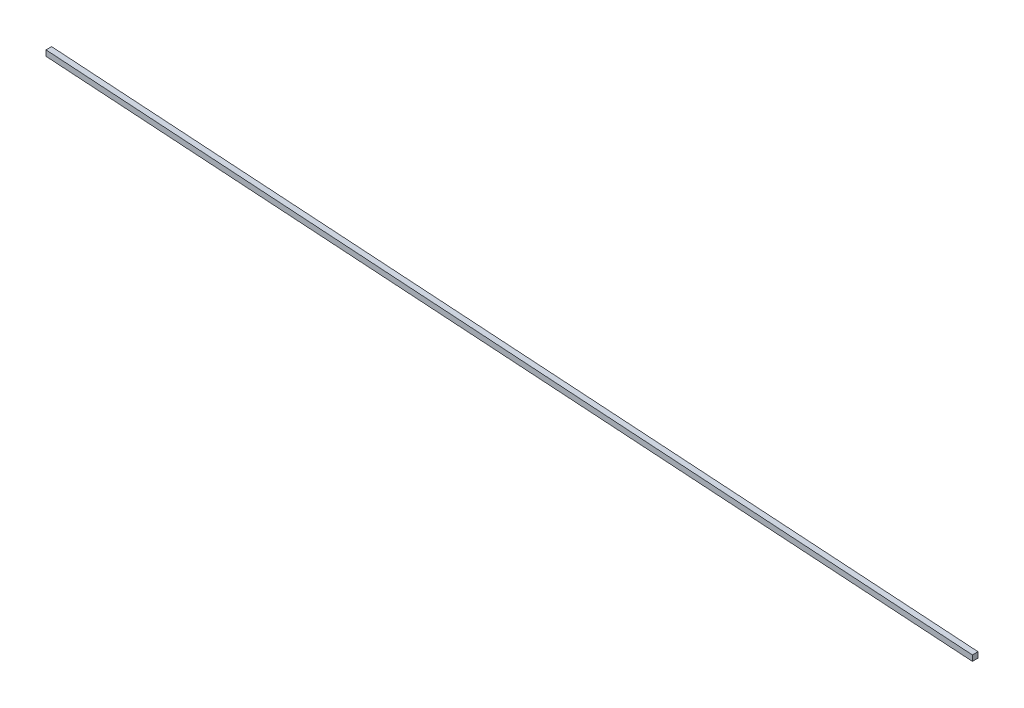
ISO-10303-21;
HEADER;
FILE_DESCRIPTION(('STEP AP214'),'2;1');
FILE_NAME('part.step','',(''),(''),'','','');
FILE_SCHEMA(('AUTOMOTIVE_DESIGN { 1 0 10303 214 1 1 1 1 }'));
ENDSEC;
DATA;
#1=APPLICATION_CONTEXT('core data for automotive mechanical design processes');
#2=APPLICATION_PROTOCOL_DEFINITION('international standard','automotive_design',2000,#1);
#3=PRODUCT_CONTEXT('',#1,'mechanical');
#4=PRODUCT('Part','Part','',(#3));
#5=PRODUCT_RELATED_PRODUCT_CATEGORY('part','',(#4));
#6=PRODUCT_DEFINITION_FORMATION('','',#4);
#7=PRODUCT_DEFINITION_CONTEXT('part definition',#1,'design');
#8=PRODUCT_DEFINITION('design','',#6,#7);
#9=PRODUCT_DEFINITION_SHAPE('','',#8);
#10=(LENGTH_UNIT() NAMED_UNIT(*) SI_UNIT(.MILLI.,.METRE.));
#11=(NAMED_UNIT(*) PLANE_ANGLE_UNIT() SI_UNIT($,.RADIAN.));
#12=(NAMED_UNIT(*) SI_UNIT($,.STERADIAN.) SOLID_ANGLE_UNIT());
#13=UNCERTAINTY_MEASURE_WITH_UNIT(LENGTH_MEASURE(1.E-05),#10,'distance_accuracy_value','');
#14=(GEOMETRIC_REPRESENTATION_CONTEXT(3) GLOBAL_UNCERTAINTY_ASSIGNED_CONTEXT((#13)) GLOBAL_UNIT_ASSIGNED_CONTEXT((#10,
#11,#12)) REPRESENTATION_CONTEXT('',''));
#15=CARTESIAN_POINT('',(0.,0.,0.));
#16=DIRECTION('',(0.,0.,1.));
#17=DIRECTION('',(1.,0.,0.));
#18=AXIS2_PLACEMENT_3D('',#15,#16,#17);
#19=CARTESIAN_POINT('',(8.80082432033214,36.066218196864,3.));
#20=DIRECTION('',(1.,0.,0.));
#21=DIRECTION('',(0.,0.,-1.));
#22=AXIS2_PLACEMENT_3D('',#19,#20,#21);
#23=PLANE('',#22);
#24=DIRECTION('',(0.,-1.,0.));
#25=VECTOR('',#24,1.);
#26=CARTESIAN_POINT('',(8.80082432033214,36.066218196864,0.));
#27=LINE('',#26,#25);
#28=CARTESIAN_POINT('',(8.80082432033214,36.066218196864,0.));
#29=VERTEX_POINT('',#28);
#30=CARTESIAN_POINT('',(8.80082432033214,33.066218196864,0.));
#31=VERTEX_POINT('',#30);
#32=EDGE_CURVE('E96',#29,#31,#27,.T.);
#33=ORIENTED_EDGE('',*,*,#32,.T.);
#34=DIRECTION('',(0.,0.,-1.));
#35=VECTOR('',#34,1.);
#36=CARTESIAN_POINT('',(8.80082432033214,33.066218196864,3.));
#37=LINE('',#36,#35);
#38=CARTESIAN_POINT('',(8.80082432033214,33.066218196864,3.));
#39=VERTEX_POINT('',#38);
#40=EDGE_CURVE('E11',#39,#31,#37,.T.);
#41=ORIENTED_EDGE('',*,*,#40,.F.);
#42=DIRECTION('',(0.,-1.,0.));
#43=VECTOR('',#42,1.);
#44=CARTESIAN_POINT('',(8.80082432033214,36.066218196864,3.));
#45=LINE('',#44,#43);
#46=CARTESIAN_POINT('',(8.80082432033214,36.066218196864,3.));
#47=VERTEX_POINT('',#46);
#48=EDGE_CURVE('E84',#47,#39,#45,.T.);
#49=ORIENTED_EDGE('',*,*,#48,.F.);
#50=DIRECTION('',(0.,0.,-1.));
#51=VECTOR('',#50,1.);
#52=CARTESIAN_POINT('',(8.80082432033214,36.066218196864,3.));
#53=LINE('',#52,#51);
#54=EDGE_CURVE('E92',#47,#29,#53,.T.);
#55=ORIENTED_EDGE('',*,*,#54,.T.);
#56=EDGE_LOOP('',(#33,#41,#49,#55));
#57=FACE_BOUND('',#56,.T.);
#58=ADVANCED_FACE('F33',(#57),#23,.F.);
#59=CARTESIAN_POINT('',(8.80082432033214,33.066218196864,3.));
#60=DIRECTION('',(0.0655167056141793,0.997851472557647,0.));
#61=DIRECTION('',(-0.997851472557647,0.0655167056141793,0.));
#62=AXIS2_PLACEMENT_3D('',#59,#60,#61);
#63=PLANE('',#62);
#64=DIRECTION('',(0.997851472557647,-0.0655167056141793,0.));
#65=VECTOR('',#64,1.);
#66=CARTESIAN_POINT('',(8.80082432033214,33.066218196864,0.));
#67=LINE('',#66,#65);
#68=CARTESIAN_POINT('',(503.800824320332,0.565620491783022,0.));
#69=VERTEX_POINT('',#68);
#70=EDGE_CURVE('E88',#31,#69,#67,.T.);
#71=ORIENTED_EDGE('',*,*,#70,.T.);
#72=DIRECTION('',(0.,0.,-1.));
#73=VECTOR('',#72,1.);
#74=CARTESIAN_POINT('',(503.800824320332,0.565620491783022,3.));
#75=LINE('',#74,#73);
#76=CARTESIAN_POINT('',(503.800824320332,0.565620491783022,3.));
#77=VERTEX_POINT('',#76);
#78=EDGE_CURVE('E41',#77,#69,#75,.T.);
#79=ORIENTED_EDGE('',*,*,#78,.F.);
#80=DIRECTION('',(0.997851472557647,-0.0655167056141793,0.));
#81=VECTOR('',#80,1.);
#82=CARTESIAN_POINT('',(8.80082432033214,33.066218196864,3.));
#83=LINE('',#82,#81);
#84=EDGE_CURVE('E79',#39,#77,#83,.T.);
#85=ORIENTED_EDGE('',*,*,#84,.F.);
#86=ORIENTED_EDGE('',*,*,#40,.T.);
#87=EDGE_LOOP('',(#71,#79,#85,#86));
#88=FACE_BOUND('',#87,.T.);
#89=ADVANCED_FACE('F87',(#88),#63,.F.);
#90=CARTESIAN_POINT('',(503.800824320332,3.56562049178302,3.));
#91=DIRECTION('',(-1.,0.,0.));
#92=DIRECTION('',(0.,0.,1.));
#93=AXIS2_PLACEMENT_3D('',#90,#91,#92);
#94=PLANE('',#93);
#95=DIRECTION('',(0.,1.,0.));
#96=VECTOR('',#95,1.);
#97=CARTESIAN_POINT('',(503.800824320332,3.56562049178302,0.));
#98=LINE('',#97,#96);
#99=CARTESIAN_POINT('',(503.800824320332,3.56562049178302,0.));
#100=VERTEX_POINT('',#99);
#101=EDGE_CURVE('E66',#69,#100,#98,.T.);
#102=ORIENTED_EDGE('',*,*,#101,.T.);
#103=DIRECTION('',(0.,0.,-1.));
#104=VECTOR('',#103,1.);
#105=CARTESIAN_POINT('',(503.800824320332,3.56562049178302,3.));
#106=LINE('',#105,#104);
#107=CARTESIAN_POINT('',(503.800824320332,3.56562049178302,3.));
#108=VERTEX_POINT('',#107);
#109=EDGE_CURVE('E89',#108,#100,#106,.T.);
#110=ORIENTED_EDGE('',*,*,#109,.F.);
#111=DIRECTION('',(0.,1.,0.));
#112=VECTOR('',#111,1.);
#113=CARTESIAN_POINT('',(503.800824320332,3.56562049178302,3.));
#114=LINE('',#113,#112);
#115=EDGE_CURVE('E82',#77,#108,#114,.T.);
#116=ORIENTED_EDGE('',*,*,#115,.F.);
#117=ORIENTED_EDGE('',*,*,#78,.T.);
#118=EDGE_LOOP('',(#102,#110,#116,#117));
#119=FACE_BOUND('',#118,.T.);
#120=ADVANCED_FACE('F90',(#119),#94,.F.);
#121=CARTESIAN_POINT('',(8.80082432033214,36.066218196864,3.));
#122=DIRECTION('',(-0.0655167056141793,-0.997851472557647,0.));
#123=DIRECTION('',(0.997851472557647,-0.0655167056141793,0.));
#124=AXIS2_PLACEMENT_3D('',#121,#122,#123);
#125=PLANE('',#124);
#126=DIRECTION('',(-0.997851472557647,0.0655167056141793,0.));
#127=VECTOR('',#126,1.);
#128=CARTESIAN_POINT('',(8.80082432033214,36.066218196864,0.));
#129=LINE('',#128,#127);
#130=EDGE_CURVE('E72',#100,#29,#129,.T.);
#131=ORIENTED_EDGE('',*,*,#130,.T.);
#132=ORIENTED_EDGE('',*,*,#54,.F.);
#133=DIRECTION('',(-0.997851472557647,0.0655167056141793,0.));
#134=VECTOR('',#133,1.);
#135=CARTESIAN_POINT('',(8.80082432033214,36.066218196864,3.));
#136=LINE('',#135,#134);
#137=EDGE_CURVE('E49',#108,#47,#136,.T.);
#138=ORIENTED_EDGE('',*,*,#137,.F.);
#139=ORIENTED_EDGE('',*,*,#109,.T.);
#140=EDGE_LOOP('',(#131,#132,#138,#139));
#141=FACE_BOUND('',#140,.T.);
#142=ADVANCED_FACE('F103',(#141),#125,.F.);
#143=CARTESIAN_POINT('',(0.,0.,3.));
#144=DIRECTION('',(0.,0.,1.));
#145=DIRECTION('',(1.,0.,0.));
#146=AXIS2_PLACEMENT_3D('',#143,#144,#145);
#147=PLANE('',#146);
#148=ORIENTED_EDGE('',*,*,#48,.T.);
#149=ORIENTED_EDGE('',*,*,#84,.T.);
#150=ORIENTED_EDGE('',*,*,#115,.T.);
#151=ORIENTED_EDGE('',*,*,#137,.T.);
#152=EDGE_LOOP('',(#148,#149,#150,#151));
#153=FACE_BOUND('',#152,.T.);
#154=ADVANCED_FACE('F80',(#153),#147,.T.);
#155=CARTESIAN_POINT('',(0.,0.,0.));
#156=DIRECTION('',(0.,0.,1.));
#157=DIRECTION('',(1.,0.,0.));
#158=AXIS2_PLACEMENT_3D('',#155,#156,#157);
#159=PLANE('',#158);
#160=ORIENTED_EDGE('',*,*,#32,.F.);
#161=ORIENTED_EDGE('',*,*,#130,.F.);
#162=ORIENTED_EDGE('',*,*,#101,.F.);
#163=ORIENTED_EDGE('',*,*,#70,.F.);
#164=EDGE_LOOP('',(#160,#161,#162,#163));
#165=FACE_BOUND('',#164,.T.);
#166=ADVANCED_FACE('F106',(#165),#159,.F.);
#167=CLOSED_SHELL('',(#58,#89,#120,#142,#154,#166));
#168=MANIFOLD_SOLID_BREP('B2',#167);
#169=ADVANCED_BREP_SHAPE_REPRESENTATION('',(#18,#168),#14);
#170=SHAPE_DEFINITION_REPRESENTATION(#9,#169);
ENDSEC;
END-ISO-10303-21;
